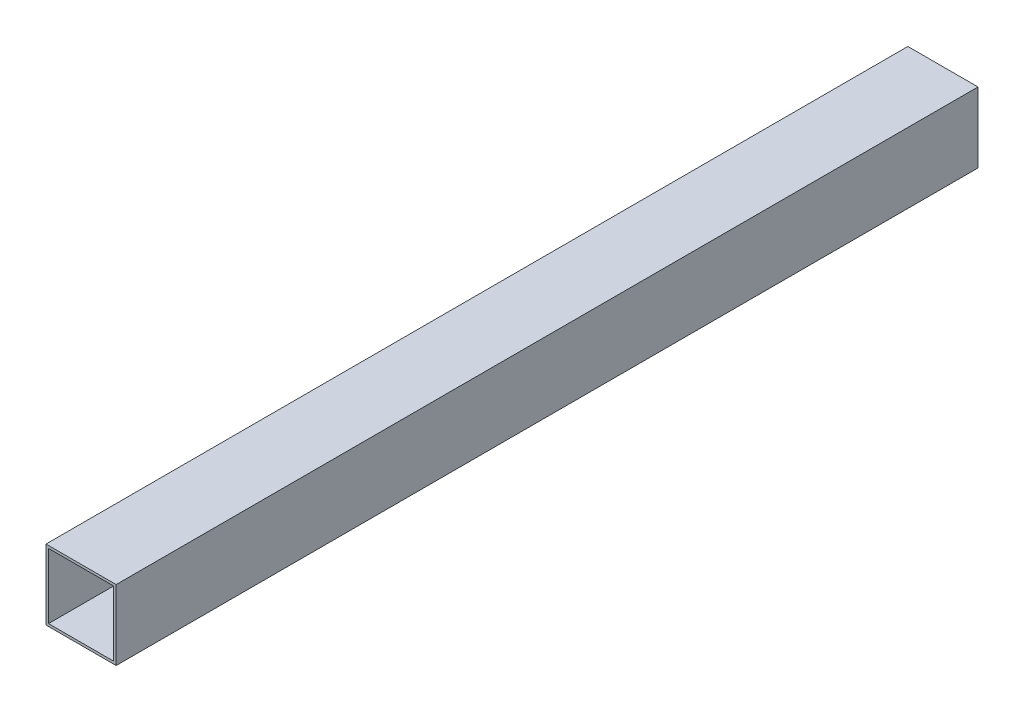
ISO-10303-21;
HEADER;
FILE_DESCRIPTION(('STEP AP214'),'2;1');
FILE_NAME('part.step','',(''),(''),'','','');
FILE_SCHEMA(('AUTOMOTIVE_DESIGN { 1 0 10303 214 1 1 1 1 }'));
ENDSEC;
DATA;
#1=APPLICATION_CONTEXT('core data for automotive mechanical design processes');
#2=APPLICATION_PROTOCOL_DEFINITION('international standard','automotive_design',2000,#1);
#3=PRODUCT_CONTEXT('',#1,'mechanical');
#4=PRODUCT('Part','Part','',(#3));
#5=PRODUCT_RELATED_PRODUCT_CATEGORY('part','',(#4));
#6=PRODUCT_DEFINITION_FORMATION('','',#4);
#7=PRODUCT_DEFINITION_CONTEXT('part definition',#1,'design');
#8=PRODUCT_DEFINITION('design','',#6,#7);
#9=PRODUCT_DEFINITION_SHAPE('','',#8);
#10=(LENGTH_UNIT() NAMED_UNIT(*) SI_UNIT(.MILLI.,.METRE.));
#11=(NAMED_UNIT(*) PLANE_ANGLE_UNIT() SI_UNIT($,.RADIAN.));
#12=(NAMED_UNIT(*) SI_UNIT($,.STERADIAN.) SOLID_ANGLE_UNIT());
#13=UNCERTAINTY_MEASURE_WITH_UNIT(LENGTH_MEASURE(1.E-05),#10,'distance_accuracy_value','');
#14=(GEOMETRIC_REPRESENTATION_CONTEXT(3) GLOBAL_UNCERTAINTY_ASSIGNED_CONTEXT((#13)) GLOBAL_UNIT_ASSIGNED_CONTEXT((#10,
#11,#12)) REPRESENTATION_CONTEXT('',''));
#15=CARTESIAN_POINT('',(0.,0.,0.));
#16=DIRECTION('',(0.,0.,1.));
#17=DIRECTION('',(1.,0.,0.));
#18=AXIS2_PLACEMENT_3D('',#15,#16,#17);
#19=CARTESIAN_POINT('',(0.,0.,430.));
#20=DIRECTION('',(0.,0.,1.));
#21=DIRECTION('',(1.,0.,0.));
#22=AXIS2_PLACEMENT_3D('',#19,#20,#21);
#23=PLANE('',#22);
#24=DIRECTION('',(0.,1.,0.));
#25=VECTOR('',#24,1.);
#26=CARTESIAN_POINT('',(35.,35.,430.));
#27=LINE('',#26,#25);
#28=CARTESIAN_POINT('',(35.,-35.,430.));
#29=VERTEX_POINT('',#28);
#30=CARTESIAN_POINT('',(35.,35.,430.));
#31=VERTEX_POINT('',#30);
#32=EDGE_CURVE('E134',#29,#31,#27,.T.);
#33=ORIENTED_EDGE('',*,*,#32,.T.);
#34=DIRECTION('',(-1.,0.,0.));
#35=VECTOR('',#34,1.);
#36=CARTESIAN_POINT('',(-35.,35.,430.));
#37=LINE('',#36,#35);
#38=CARTESIAN_POINT('',(-35.,35.,430.));
#39=VERTEX_POINT('',#38);
#40=EDGE_CURVE('E137',#31,#39,#37,.T.);
#41=ORIENTED_EDGE('',*,*,#40,.T.);
#42=DIRECTION('',(0.,-1.,0.));
#43=VECTOR('',#42,1.);
#44=CARTESIAN_POINT('',(-35.,35.,430.));
#45=LINE('',#44,#43);
#46=CARTESIAN_POINT('',(-35.,-35.,430.));
#47=VERTEX_POINT('',#46);
#48=EDGE_CURVE('E140',#39,#47,#45,.T.);
#49=ORIENTED_EDGE('',*,*,#48,.T.);
#50=DIRECTION('',(1.,0.,0.));
#51=VECTOR('',#50,1.);
#52=CARTESIAN_POINT('',(-35.,-35.,430.));
#53=LINE('',#52,#51);
#54=EDGE_CURVE('E142',#47,#29,#53,.T.);
#55=ORIENTED_EDGE('',*,*,#54,.T.);
#56=EDGE_LOOP('',(#33,#41,#49,#55));
#57=FACE_BOUND('',#56,.T.);
#58=DIRECTION('',(0.,-1.,0.));
#59=VECTOR('',#58,1.);
#60=CARTESIAN_POINT('',(-32.5,32.5,430.));
#61=LINE('',#60,#59);
#62=CARTESIAN_POINT('',(-32.5,32.5,430.));
#63=VERTEX_POINT('',#62);
#64=CARTESIAN_POINT('',(-32.5,-32.5,430.));
#65=VERTEX_POINT('',#64);
#66=EDGE_CURVE('E106',#63,#65,#61,.T.);
#67=ORIENTED_EDGE('',*,*,#66,.F.);
#68=DIRECTION('',(-1.,0.,0.));
#69=VECTOR('',#68,1.);
#70=CARTESIAN_POINT('',(-32.5,32.5,430.));
#71=LINE('',#70,#69);
#72=CARTESIAN_POINT('',(32.5,32.5,430.));
#73=VERTEX_POINT('',#72);
#74=EDGE_CURVE('E98',#73,#63,#71,.T.);
#75=ORIENTED_EDGE('',*,*,#74,.F.);
#76=DIRECTION('',(0.,1.,0.));
#77=VECTOR('',#76,1.);
#78=CARTESIAN_POINT('',(32.5,32.5,430.));
#79=LINE('',#78,#77);
#80=CARTESIAN_POINT('',(32.5,-32.5,430.));
#81=VERTEX_POINT('',#80);
#82=EDGE_CURVE('E120',#81,#73,#79,.T.);
#83=ORIENTED_EDGE('',*,*,#82,.F.);
#84=DIRECTION('',(1.,0.,0.));
#85=VECTOR('',#84,1.);
#86=CARTESIAN_POINT('',(-32.5,-32.5,430.));
#87=LINE('',#86,#85);
#88=EDGE_CURVE('E118',#65,#81,#87,.T.);
#89=ORIENTED_EDGE('',*,*,#88,.F.);
#90=EDGE_LOOP('',(#67,#75,#83,#89));
#91=FACE_BOUND('',#90,.T.);
#92=ADVANCED_FACE('F33',(#57,#91),#23,.T.);
#93=CARTESIAN_POINT('',(0.,0.,-430.));
#94=DIRECTION('',(0.,0.,1.));
#95=DIRECTION('',(1.,0.,0.));
#96=AXIS2_PLACEMENT_3D('',#93,#94,#95);
#97=PLANE('',#96);
#98=DIRECTION('',(0.,1.,0.));
#99=VECTOR('',#98,1.);
#100=CARTESIAN_POINT('',(35.,35.,-430.));
#101=LINE('',#100,#99);
#102=CARTESIAN_POINT('',(35.,-35.,-430.));
#103=VERTEX_POINT('',#102);
#104=CARTESIAN_POINT('',(35.,35.,-430.));
#105=VERTEX_POINT('',#104);
#106=EDGE_CURVE('E114',#103,#105,#101,.T.);
#107=ORIENTED_EDGE('',*,*,#106,.F.);
#108=DIRECTION('',(1.,0.,0.));
#109=VECTOR('',#108,1.);
#110=CARTESIAN_POINT('',(-35.,-35.,-430.));
#111=LINE('',#110,#109);
#112=CARTESIAN_POINT('',(-35.,-35.,-430.));
#113=VERTEX_POINT('',#112);
#114=EDGE_CURVE('E138',#113,#103,#111,.T.);
#115=ORIENTED_EDGE('',*,*,#114,.F.);
#116=DIRECTION('',(0.,-1.,0.));
#117=VECTOR('',#116,1.);
#118=CARTESIAN_POINT('',(-35.,35.,-430.));
#119=LINE('',#118,#117);
#120=CARTESIAN_POINT('',(-35.,35.,-430.));
#121=VERTEX_POINT('',#120);
#122=EDGE_CURVE('E149',#121,#113,#119,.T.);
#123=ORIENTED_EDGE('',*,*,#122,.F.);
#124=DIRECTION('',(-1.,0.,0.));
#125=VECTOR('',#124,1.);
#126=CARTESIAN_POINT('',(-35.,35.,-430.));
#127=LINE('',#126,#125);
#128=EDGE_CURVE('E147',#105,#121,#127,.T.);
#129=ORIENTED_EDGE('',*,*,#128,.F.);
#130=EDGE_LOOP('',(#107,#115,#123,#129));
#131=FACE_BOUND('',#130,.T.);
#132=DIRECTION('',(-1.,0.,0.));
#133=VECTOR('',#132,1.);
#134=CARTESIAN_POINT('',(-32.5,32.5,-430.));
#135=LINE('',#134,#133);
#136=CARTESIAN_POINT('',(32.5,32.5,-430.));
#137=VERTEX_POINT('',#136);
#138=CARTESIAN_POINT('',(-32.5,32.5,-430.));
#139=VERTEX_POINT('',#138);
#140=EDGE_CURVE('E56',#137,#139,#135,.T.);
#141=ORIENTED_EDGE('',*,*,#140,.T.);
#142=DIRECTION('',(0.,-1.,0.));
#143=VECTOR('',#142,1.);
#144=CARTESIAN_POINT('',(-32.5,32.5,-430.));
#145=LINE('',#144,#143);
#146=CARTESIAN_POINT('',(-32.5,-32.5,-430.));
#147=VERTEX_POINT('',#146);
#148=EDGE_CURVE('E113',#139,#147,#145,.T.);
#149=ORIENTED_EDGE('',*,*,#148,.T.);
#150=DIRECTION('',(1.,0.,0.));
#151=VECTOR('',#150,1.);
#152=CARTESIAN_POINT('',(-32.5,-32.5,-430.));
#153=LINE('',#152,#151);
#154=CARTESIAN_POINT('',(32.5,-32.5,-430.));
#155=VERTEX_POINT('',#154);
#156=EDGE_CURVE('E126',#147,#155,#153,.T.);
#157=ORIENTED_EDGE('',*,*,#156,.T.);
#158=DIRECTION('',(0.,1.,0.));
#159=VECTOR('',#158,1.);
#160=CARTESIAN_POINT('',(32.5,32.5,-430.));
#161=LINE('',#160,#159);
#162=EDGE_CURVE('E107',#155,#137,#161,.T.);
#163=ORIENTED_EDGE('',*,*,#162,.T.);
#164=EDGE_LOOP('',(#141,#149,#157,#163));
#165=FACE_BOUND('',#164,.T.);
#166=ADVANCED_FACE('F167',(#131,#165),#97,.F.);
#167=CARTESIAN_POINT('',(35.,35.,430.));
#168=DIRECTION('',(-1.,0.,0.));
#169=DIRECTION('',(0.,-1.,0.));
#170=AXIS2_PLACEMENT_3D('',#167,#168,#169);
#171=PLANE('',#170);
#172=ORIENTED_EDGE('',*,*,#106,.T.);
#173=DIRECTION('',(0.,0.,-1.));
#174=VECTOR('',#173,1.);
#175=CARTESIAN_POINT('',(35.,35.,430.));
#176=LINE('',#175,#174);
#177=EDGE_CURVE('E11',#31,#105,#176,.T.);
#178=ORIENTED_EDGE('',*,*,#177,.F.);
#179=ORIENTED_EDGE('',*,*,#32,.F.);
#180=DIRECTION('',(0.,0.,-1.));
#181=VECTOR('',#180,1.);
#182=CARTESIAN_POINT('',(35.,-35.,430.));
#183=LINE('',#182,#181);
#184=EDGE_CURVE('E144',#29,#103,#183,.T.);
#185=ORIENTED_EDGE('',*,*,#184,.T.);
#186=EDGE_LOOP('',(#172,#178,#179,#185));
#187=FACE_BOUND('',#186,.T.);
#188=ADVANCED_FACE('F35',(#187),#171,.F.);
#189=CARTESIAN_POINT('',(-35.,35.,430.));
#190=DIRECTION('',(0.,-1.,0.));
#191=DIRECTION('',(0.,0.,-1.));
#192=AXIS2_PLACEMENT_3D('',#189,#190,#191);
#193=PLANE('',#192);
#194=ORIENTED_EDGE('',*,*,#128,.T.);
#195=DIRECTION('',(0.,0.,-1.));
#196=VECTOR('',#195,1.);
#197=CARTESIAN_POINT('',(-35.,35.,430.));
#198=LINE('',#197,#196);
#199=EDGE_CURVE('E41',#39,#121,#198,.T.);
#200=ORIENTED_EDGE('',*,*,#199,.F.);
#201=ORIENTED_EDGE('',*,*,#40,.F.);
#202=ORIENTED_EDGE('',*,*,#177,.T.);
#203=EDGE_LOOP('',(#194,#200,#201,#202));
#204=FACE_BOUND('',#203,.T.);
#205=ADVANCED_FACE('F177',(#204),#193,.F.);
#206=CARTESIAN_POINT('',(-35.,35.,430.));
#207=DIRECTION('',(1.,0.,0.));
#208=DIRECTION('',(0.,1.,0.));
#209=AXIS2_PLACEMENT_3D('',#206,#207,#208);
#210=PLANE('',#209);
#211=ORIENTED_EDGE('',*,*,#122,.T.);
#212=DIRECTION('',(0.,0.,-1.));
#213=VECTOR('',#212,1.);
#214=CARTESIAN_POINT('',(-35.,-35.,430.));
#215=LINE('',#214,#213);
#216=EDGE_CURVE('E154',#47,#113,#215,.T.);
#217=ORIENTED_EDGE('',*,*,#216,.F.);
#218=ORIENTED_EDGE('',*,*,#48,.F.);
#219=ORIENTED_EDGE('',*,*,#199,.T.);
#220=EDGE_LOOP('',(#211,#217,#218,#219));
#221=FACE_BOUND('',#220,.T.);
#222=ADVANCED_FACE('F161',(#221),#210,.F.);
#223=CARTESIAN_POINT('',(-35.,-35.,430.));
#224=DIRECTION('',(0.,1.,0.));
#225=DIRECTION('',(0.,0.,1.));
#226=AXIS2_PLACEMENT_3D('',#223,#224,#225);
#227=PLANE('',#226);
#228=ORIENTED_EDGE('',*,*,#114,.T.);
#229=ORIENTED_EDGE('',*,*,#184,.F.);
#230=ORIENTED_EDGE('',*,*,#54,.F.);
#231=ORIENTED_EDGE('',*,*,#216,.T.);
#232=EDGE_LOOP('',(#228,#229,#230,#231));
#233=FACE_BOUND('',#232,.T.);
#234=ADVANCED_FACE('F171',(#233),#227,.F.);
#235=CARTESIAN_POINT('',(-32.5,32.5,430.));
#236=DIRECTION('',(0.,-1.,0.));
#237=DIRECTION('',(0.,0.,-1.));
#238=AXIS2_PLACEMENT_3D('',#235,#236,#237);
#239=PLANE('',#238);
#240=ORIENTED_EDGE('',*,*,#140,.F.);
#241=DIRECTION('',(0.,0.,-1.));
#242=VECTOR('',#241,1.);
#243=CARTESIAN_POINT('',(32.5,32.5,430.));
#244=LINE('',#243,#242);
#245=EDGE_CURVE('E102',#73,#137,#244,.T.);
#246=ORIENTED_EDGE('',*,*,#245,.F.);
#247=ORIENTED_EDGE('',*,*,#74,.T.);
#248=DIRECTION('',(0.,0.,-1.));
#249=VECTOR('',#248,1.);
#250=CARTESIAN_POINT('',(-32.5,32.5,430.));
#251=LINE('',#250,#249);
#252=EDGE_CURVE('E101',#63,#139,#251,.T.);
#253=ORIENTED_EDGE('',*,*,#252,.T.);
#254=EDGE_LOOP('',(#240,#246,#247,#253));
#255=FACE_BOUND('',#254,.T.);
#256=ADVANCED_FACE('F100',(#255),#239,.T.);
#257=CARTESIAN_POINT('',(-32.5,32.5,430.));
#258=DIRECTION('',(1.,0.,0.));
#259=DIRECTION('',(0.,0.,-1.));
#260=AXIS2_PLACEMENT_3D('',#257,#258,#259);
#261=PLANE('',#260);
#262=ORIENTED_EDGE('',*,*,#148,.F.);
#263=ORIENTED_EDGE('',*,*,#252,.F.);
#264=ORIENTED_EDGE('',*,*,#66,.T.);
#265=DIRECTION('',(0.,0.,-1.));
#266=VECTOR('',#265,1.);
#267=CARTESIAN_POINT('',(-32.5,-32.5,430.));
#268=LINE('',#267,#266);
#269=EDGE_CURVE('E115',#65,#147,#268,.T.);
#270=ORIENTED_EDGE('',*,*,#269,.T.);
#271=EDGE_LOOP('',(#262,#263,#264,#270));
#272=FACE_BOUND('',#271,.T.);
#273=ADVANCED_FACE('F110',(#272),#261,.T.);
#274=CARTESIAN_POINT('',(-32.5,-32.5,430.));
#275=DIRECTION('',(0.,1.,0.));
#276=DIRECTION('',(0.,0.,1.));
#277=AXIS2_PLACEMENT_3D('',#274,#275,#276);
#278=PLANE('',#277);
#279=ORIENTED_EDGE('',*,*,#156,.F.);
#280=ORIENTED_EDGE('',*,*,#269,.F.);
#281=ORIENTED_EDGE('',*,*,#88,.T.);
#282=DIRECTION('',(0.,0.,-1.));
#283=VECTOR('',#282,1.);
#284=CARTESIAN_POINT('',(32.5,-32.5,430.));
#285=LINE('',#284,#283);
#286=EDGE_CURVE('E48',#81,#155,#285,.T.);
#287=ORIENTED_EDGE('',*,*,#286,.T.);
#288=EDGE_LOOP('',(#279,#280,#281,#287));
#289=FACE_BOUND('',#288,.T.);
#290=ADVANCED_FACE('F200',(#289),#278,.T.);
#291=CARTESIAN_POINT('',(32.5,32.5,430.));
#292=DIRECTION('',(-1.,0.,0.));
#293=DIRECTION('',(0.,0.,1.));
#294=AXIS2_PLACEMENT_3D('',#291,#292,#293);
#295=PLANE('',#294);
#296=ORIENTED_EDGE('',*,*,#162,.F.);
#297=ORIENTED_EDGE('',*,*,#286,.F.);
#298=ORIENTED_EDGE('',*,*,#82,.T.);
#299=ORIENTED_EDGE('',*,*,#245,.T.);
#300=EDGE_LOOP('',(#296,#297,#298,#299));
#301=FACE_BOUND('',#300,.T.);
#302=ADVANCED_FACE('F204',(#301),#295,.T.);
#303=CLOSED_SHELL('',(#92,#166,#188,#205,#222,#234,#256,#273,#290,#302));
#304=MANIFOLD_SOLID_BREP('B2',#303);
#305=ADVANCED_BREP_SHAPE_REPRESENTATION('',(#18,#304),#14);
#306=SHAPE_DEFINITION_REPRESENTATION(#9,#305);
ENDSEC;
END-ISO-10303-21;
